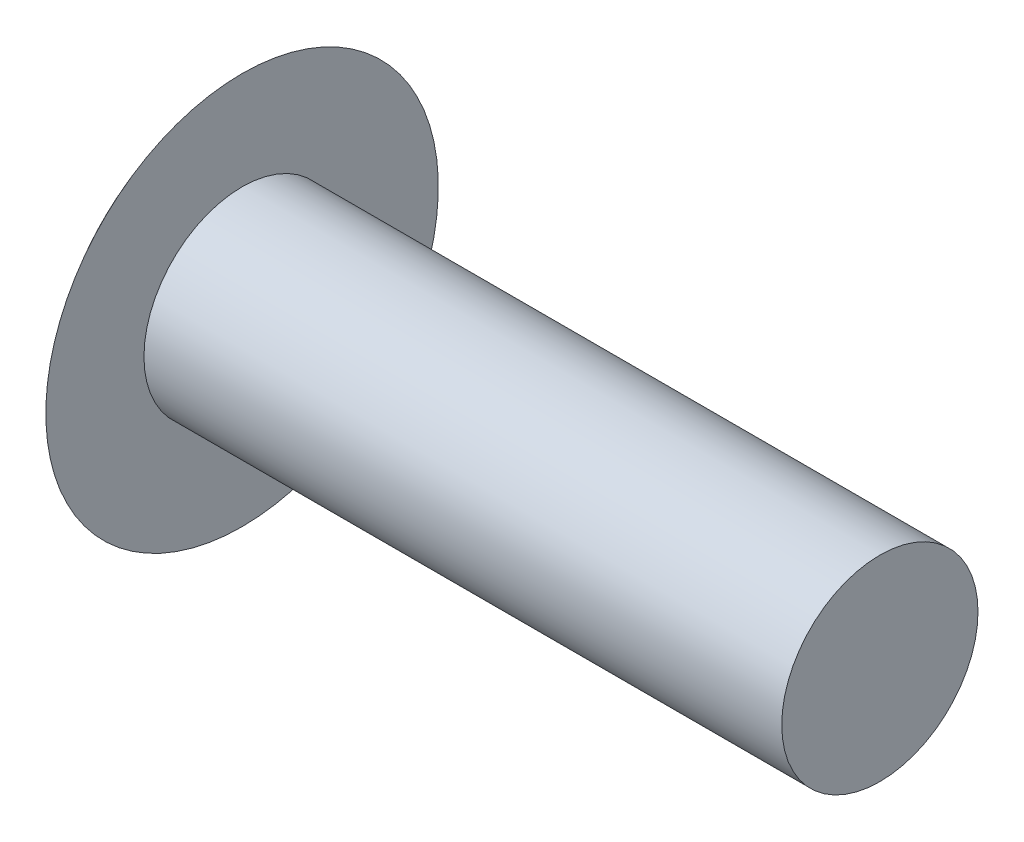
ISO-10303-21;
HEADER;
FILE_DESCRIPTION(('STEP AP214'),'2;1');
FILE_NAME('part.step','',(''),(''),'','','');
FILE_SCHEMA(('AUTOMOTIVE_DESIGN { 1 0 10303 214 1 1 1 1 }'));
ENDSEC;
DATA;
#1=APPLICATION_CONTEXT('core data for automotive mechanical design processes');
#2=APPLICATION_PROTOCOL_DEFINITION('international standard','automotive_design',2000,#1);
#3=PRODUCT_CONTEXT('',#1,'mechanical');
#4=PRODUCT('Part','Part','',(#3));
#5=PRODUCT_RELATED_PRODUCT_CATEGORY('part','',(#4));
#6=PRODUCT_DEFINITION_FORMATION('','',#4);
#7=PRODUCT_DEFINITION_CONTEXT('part definition',#1,'design');
#8=PRODUCT_DEFINITION('design','',#6,#7);
#9=PRODUCT_DEFINITION_SHAPE('','',#8);
#10=(LENGTH_UNIT() NAMED_UNIT(*) SI_UNIT(.MILLI.,.METRE.));
#11=(NAMED_UNIT(*) PLANE_ANGLE_UNIT() SI_UNIT($,.RADIAN.));
#12=(NAMED_UNIT(*) SI_UNIT($,.STERADIAN.) SOLID_ANGLE_UNIT());
#13=UNCERTAINTY_MEASURE_WITH_UNIT(LENGTH_MEASURE(1.E-05),#10,'distance_accuracy_value','');
#14=(GEOMETRIC_REPRESENTATION_CONTEXT(3) GLOBAL_UNCERTAINTY_ASSIGNED_CONTEXT((#13)) GLOBAL_UNIT_ASSIGNED_CONTEXT((#10,
#11,#12)) REPRESENTATION_CONTEXT('',''));
#15=CARTESIAN_POINT('',(0.,0.,0.));
#16=DIRECTION('',(0.,0.,1.));
#17=DIRECTION('',(1.,0.,0.));
#18=AXIS2_PLACEMENT_3D('',#15,#16,#17);
#19=CARTESIAN_POINT('',(13.,0.,0.));
#20=DIRECTION('',(-1.,0.,0.));
#21=DIRECTION('',(0.,0.,1.));
#22=AXIS2_PLACEMENT_3D('',#19,#20,#21);
#23=CYLINDRICAL_SURFACE('',#22,2.);
#24=CARTESIAN_POINT('',(13.,0.,0.));
#25=DIRECTION('',(1.,0.,0.));
#26=DIRECTION('',(0.,0.,-1.));
#27=AXIS2_PLACEMENT_3D('',#24,#25,#26);
#28=CIRCLE('',#27,2.);
#29=CARTESIAN_POINT('',(13.,0.,2.));
#30=VERTEX_POINT('',#29);
#31=EDGE_CURVE('E10',#30,#30,#28,.T.);
#32=CARTESIAN_POINT('',(0.,0.,0.));
#33=DIRECTION('',(-1.,0.,0.));
#34=DIRECTION('',(0.,-1.,0.));
#35=AXIS2_PLACEMENT_3D('',#32,#33,#34);
#36=CIRCLE('',#35,2.);
#37=CARTESIAN_POINT('',(0.,0.,2.));
#38=VERTEX_POINT('',#37);
#39=EDGE_CURVE('E37',#38,#38,#36,.T.);
#40=CARTESIAN_POINT('',(13.,0.,2.));
#41=CARTESIAN_POINT('',(12.8645833333333,0.,2.));
#42=CARTESIAN_POINT('',(12.7291666666667,0.,2.));
#43=CARTESIAN_POINT('',(12.4583333333333,0.,2.));
#44=CARTESIAN_POINT('',(12.3229166666667,0.,2.));
#45=CARTESIAN_POINT('',(12.0520833333333,0.,2.));
#46=CARTESIAN_POINT('',(11.9166666666667,0.,2.));
#47=CARTESIAN_POINT('',(11.6458333333333,0.,2.));
#48=CARTESIAN_POINT('',(11.5104166666667,0.,2.));
#49=CARTESIAN_POINT('',(11.2395833333333,0.,2.));
#50=CARTESIAN_POINT('',(11.1041666666667,0.,2.));
#51=CARTESIAN_POINT('',(10.8333333333333,0.,2.));
#52=CARTESIAN_POINT('',(10.6979166666667,0.,2.));
#53=CARTESIAN_POINT('',(10.4270833333333,0.,2.));
#54=CARTESIAN_POINT('',(10.2916666666667,0.,2.));
#55=CARTESIAN_POINT('',(10.0208333333333,0.,2.));
#56=CARTESIAN_POINT('',(9.88541666666667,0.,2.));
#57=CARTESIAN_POINT('',(9.61458333333333,0.,2.));
#58=CARTESIAN_POINT('',(9.47916666666667,0.,2.));
#59=CARTESIAN_POINT('',(9.20833333333333,0.,2.));
#60=CARTESIAN_POINT('',(9.07291666666666,0.,2.));
#61=CARTESIAN_POINT('',(8.80208333333333,0.,2.));
#62=CARTESIAN_POINT('',(8.66666666666667,0.,2.));
#63=CARTESIAN_POINT('',(8.39583333333333,0.,2.));
#64=CARTESIAN_POINT('',(8.26041666666667,0.,2.));
#65=CARTESIAN_POINT('',(7.98958333333333,0.,2.));
#66=CARTESIAN_POINT('',(7.85416666666667,0.,2.));
#67=CARTESIAN_POINT('',(7.58333333333333,0.,2.));
#68=CARTESIAN_POINT('',(7.44791666666667,0.,2.));
#69=CARTESIAN_POINT('',(7.17708333333333,0.,2.));
#70=CARTESIAN_POINT('',(7.04166666666667,0.,2.));
#71=CARTESIAN_POINT('',(6.77083333333333,0.,2.));
#72=CARTESIAN_POINT('',(6.63541666666667,0.,2.));
#73=CARTESIAN_POINT('',(6.36458333333333,0.,2.));
#74=CARTESIAN_POINT('',(6.22916666666667,0.,2.));
#75=CARTESIAN_POINT('',(5.95833333333333,0.,2.));
#76=CARTESIAN_POINT('',(5.82291666666667,0.,2.));
#77=CARTESIAN_POINT('',(5.55208333333333,0.,2.));
#78=CARTESIAN_POINT('',(5.41666666666667,0.,2.));
#79=CARTESIAN_POINT('',(5.14583333333333,0.,2.));
#80=CARTESIAN_POINT('',(5.01041666666667,0.,2.));
#81=CARTESIAN_POINT('',(4.73958333333333,0.,2.));
#82=CARTESIAN_POINT('',(4.60416666666667,0.,2.));
#83=CARTESIAN_POINT('',(4.33333333333333,0.,2.));
#84=CARTESIAN_POINT('',(4.19791666666667,0.,2.));
#85=CARTESIAN_POINT('',(3.92708333333333,0.,2.));
#86=CARTESIAN_POINT('',(3.79166666666667,0.,2.));
#87=CARTESIAN_POINT('',(3.52083333333333,0.,2.));
#88=CARTESIAN_POINT('',(3.38541666666667,0.,2.));
#89=CARTESIAN_POINT('',(3.11458333333333,0.,2.));
#90=CARTESIAN_POINT('',(2.97916666666667,0.,2.));
#91=CARTESIAN_POINT('',(2.70833333333333,0.,2.));
#92=CARTESIAN_POINT('',(2.57291666666667,0.,2.));
#93=CARTESIAN_POINT('',(2.30208333333333,0.,2.));
#94=CARTESIAN_POINT('',(2.16666666666667,0.,2.));
#95=CARTESIAN_POINT('',(1.89583333333333,0.,2.));
#96=CARTESIAN_POINT('',(1.76041666666667,0.,2.));
#97=CARTESIAN_POINT('',(1.48958333333333,0.,2.));
#98=CARTESIAN_POINT('',(1.35416666666667,0.,2.));
#99=CARTESIAN_POINT('',(1.08333333333333,0.,2.));
#100=CARTESIAN_POINT('',(0.947916666666667,0.,2.));
#101=CARTESIAN_POINT('',(0.677083333333334,0.,2.));
#102=CARTESIAN_POINT('',(0.541666666666667,0.,2.));
#103=CARTESIAN_POINT('',(0.270833333333334,0.,2.));
#104=CARTESIAN_POINT('',(0.135416666666667,0.,2.));
#105=CARTESIAN_POINT('',(0.,0.,2.));
#106=B_SPLINE_CURVE_WITH_KNOTS('',3,(#40,#41,#42,#43,#44,#45,#46,#47,#48,#49,#50,#51,#52,#53,
#54,#55,#56,#57,#58,#59,#60,#61,#62,#63,#64,#65,#66,#67,#68,#69,#70,#71,#72,#73,#74,#75,#76,#77,
#78,#79,#80,#81,#82,#83,#84,#85,#86,#87,#88,#89,#90,#91,#92,#93,#94,#95,#96,#97,#98,#99,#100,
#101,#102,#103,#104,#105),.UNSPECIFIED.,.F.,.F.,(4,2,2,2,2,2,2,2,2,2,2,2,2,2,2,2,2,2,2,2,2,2,2,
2,2,2,2,2,2,2,2,2,4),(0.,0.40625,0.812500000000001,1.21875,1.625,2.03125,2.4375,2.84375,3.25,
3.65625,4.0625,4.46875,4.875,5.28125,5.6875,6.09375,6.5,6.90625,7.3125,7.71875,8.125,8.53125,
8.9375,9.34375,9.75,10.15625,10.5625,10.96875,11.375,11.78125,12.1875,12.59375,13.),.UNSPECIFIED.);
#107=EDGE_CURVE('BSEAM31',#30,#38,#106,.T.);
#108=ORIENTED_EDGE('',*,*,#31,.F.);
#109=ORIENTED_EDGE('',*,*,#39,.F.);
#110=ORIENTED_EDGE('',*,*,#107,.T.);
#111=ORIENTED_EDGE('',*,*,#107,.F.);
#112=EDGE_LOOP('',(#108,#110,#109,#111));
#113=FACE_BOUND('',#112,.T.);
#114=ADVANCED_FACE('F31',(#113),#23,.T.);
#115=CARTESIAN_POINT('',(13.,0.,0.));
#116=DIRECTION('',(1.,0.,0.));
#117=DIRECTION('',(0.,0.,-1.));
#118=AXIS2_PLACEMENT_3D('',#115,#116,#117);
#119=PLANE('',#118);
#120=ORIENTED_EDGE('',*,*,#31,.T.);
#121=EDGE_LOOP('',(#120));
#122=FACE_BOUND('',#121,.T.);
#123=ADVANCED_FACE('F52',(#122),#119,.T.);
#124=CARTESIAN_POINT('',(0.,0.,0.));
#125=DIRECTION('',(-1.,0.,0.));
#126=DIRECTION('',(0.,-1.,0.));
#127=AXIS2_PLACEMENT_3D('',#124,#125,#126);
#128=PLANE('',#127);
#129=ORIENTED_EDGE('',*,*,#39,.T.);
#130=EDGE_LOOP('',(#129));
#131=FACE_BOUND('',#130,.T.);
#132=CARTESIAN_POINT('',(0.,0.,0.));
#133=DIRECTION('',(-1.,0.,0.));
#134=DIRECTION('',(0.,-1.,0.));
#135=AXIS2_PLACEMENT_3D('',#132,#133,#134);
#136=CIRCLE('',#135,4.);
#137=CARTESIAN_POINT('',(0.,-4.,0.));
#138=VERTEX_POINT('',#137);
#139=EDGE_CURVE('E41',#138,#138,#136,.T.);
#140=ORIENTED_EDGE('',*,*,#139,.F.);
#141=EDGE_LOOP('',(#140));
#142=FACE_BOUND('',#141,.T.);
#143=ADVANCED_FACE('F50',(#131,#142),#128,.F.);
#144=CARTESIAN_POINT('',(5.21692922889042,0.,0.));
#145=DIRECTION('',(-1.,0.,0.));
#146=DIRECTION('',(0.,1.,0.));
#147=AXIS2_PLACEMENT_3D('',#144,#145,#146);
#148=SPHERICAL_SURFACE('',#147,6.57391440309738);
#149=ORIENTED_EDGE('',*,*,#139,.T.);
#150=EDGE_LOOP('',(#149));
#151=FACE_BOUND('',#150,.T.);
#152=ADVANCED_FACE('F48',(#151),#148,.T.);
#153=CLOSED_SHELL('',(#114,#123,#143,#152));
#154=MANIFOLD_SOLID_BREP('B2',#153);
#155=ADVANCED_BREP_SHAPE_REPRESENTATION('',(#18,#154),#14);
#156=SHAPE_DEFINITION_REPRESENTATION(#9,#155);
ENDSEC;
END-ISO-10303-21;
